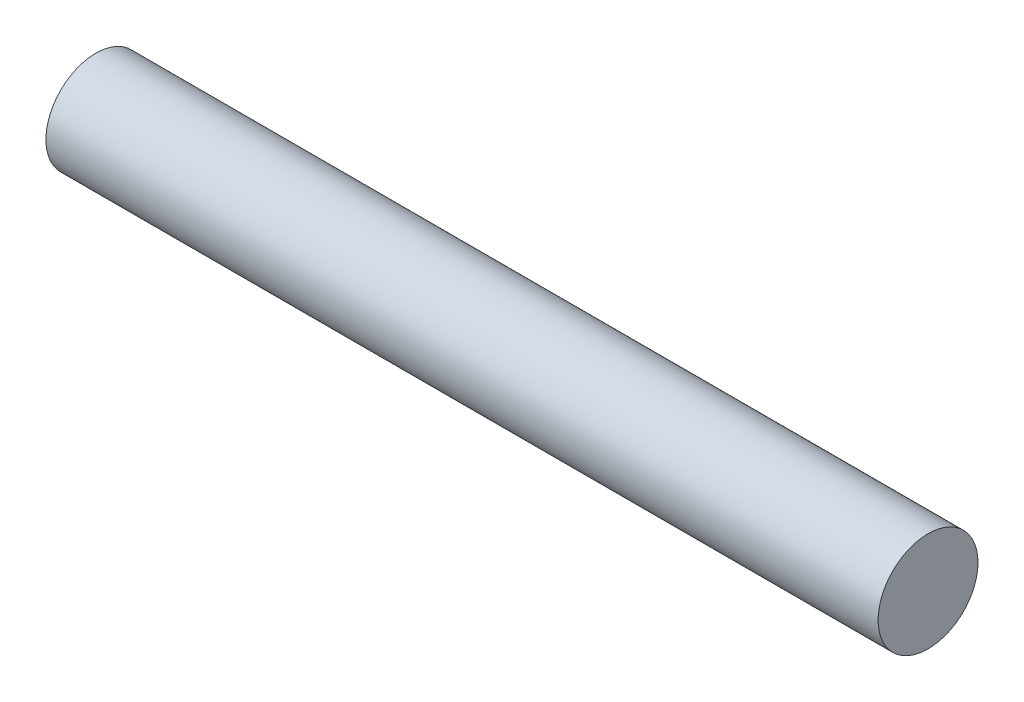
ISO-10303-21;
HEADER;
FILE_DESCRIPTION(('STEP AP214'),'2;1');
FILE_NAME('part.step','',(''),(''),'','','');
FILE_SCHEMA(('AUTOMOTIVE_DESIGN { 1 0 10303 214 1 1 1 1 }'));
ENDSEC;
DATA;
#1=APPLICATION_CONTEXT('core data for automotive mechanical design processes');
#2=APPLICATION_PROTOCOL_DEFINITION('international standard','automotive_design',2000,#1);
#3=PRODUCT_CONTEXT('',#1,'mechanical');
#4=PRODUCT('Part','Part','',(#3));
#5=PRODUCT_RELATED_PRODUCT_CATEGORY('part','',(#4));
#6=PRODUCT_DEFINITION_FORMATION('','',#4);
#7=PRODUCT_DEFINITION_CONTEXT('part definition',#1,'design');
#8=PRODUCT_DEFINITION('design','',#6,#7);
#9=PRODUCT_DEFINITION_SHAPE('','',#8);
#10=(LENGTH_UNIT() NAMED_UNIT(*) SI_UNIT(.MILLI.,.METRE.));
#11=(NAMED_UNIT(*) PLANE_ANGLE_UNIT() SI_UNIT($,.RADIAN.));
#12=(NAMED_UNIT(*) SI_UNIT($,.STERADIAN.) SOLID_ANGLE_UNIT());
#13=UNCERTAINTY_MEASURE_WITH_UNIT(LENGTH_MEASURE(1.E-05),#10,'distance_accuracy_value','');
#14=(GEOMETRIC_REPRESENTATION_CONTEXT(3) GLOBAL_UNCERTAINTY_ASSIGNED_CONTEXT((#13)) GLOBAL_UNIT_ASSIGNED_CONTEXT((#10,
#11,#12)) REPRESENTATION_CONTEXT('',''));
#15=CARTESIAN_POINT('',(0.,0.,0.));
#16=DIRECTION('',(0.,0.,1.));
#17=DIRECTION('',(1.,0.,0.));
#18=AXIS2_PLACEMENT_3D('',#15,#16,#17);
#19=CARTESIAN_POINT('',(50.,0.,0.));
#20=DIRECTION('',(-1.,0.,0.));
#21=DIRECTION('',(0.,0.,1.));
#22=AXIS2_PLACEMENT_3D('',#19,#20,#21);
#23=CYLINDRICAL_SURFACE('',#22,3.);
#24=CARTESIAN_POINT('',(50.,0.,0.));
#25=DIRECTION('',(1.,0.,0.));
#26=DIRECTION('',(0.,0.,-1.));
#27=AXIS2_PLACEMENT_3D('',#24,#25,#26);
#28=CIRCLE('',#27,3.);
#29=CARTESIAN_POINT('',(50.,0.,-3.));
#30=VERTEX_POINT('',#29);
#31=EDGE_CURVE('E10',#30,#30,#28,.T.);
#32=ORIENTED_EDGE('',*,*,#31,.F.);
#33=EDGE_LOOP('',(#32));
#34=FACE_BOUND('',#33,.T.);
#35=CARTESIAN_POINT('',(0.,0.,0.));
#36=DIRECTION('',(1.,0.,0.));
#37=DIRECTION('',(0.,0.,-1.));
#38=AXIS2_PLACEMENT_3D('',#35,#36,#37);
#39=CIRCLE('',#38,3.);
#40=CARTESIAN_POINT('',(0.,0.,-3.));
#41=VERTEX_POINT('',#40);
#42=EDGE_CURVE('E38',#41,#41,#39,.T.);
#43=ORIENTED_EDGE('',*,*,#42,.T.);
#44=EDGE_LOOP('',(#43));
#45=FACE_BOUND('',#44,.T.);
#46=ADVANCED_FACE('F35',(#34,#45),#23,.T.);
#47=CARTESIAN_POINT('',(50.,0.,0.));
#48=DIRECTION('',(1.,0.,0.));
#49=DIRECTION('',(0.,0.,-1.));
#50=AXIS2_PLACEMENT_3D('',#47,#48,#49);
#51=PLANE('',#50);
#52=ORIENTED_EDGE('',*,*,#31,.T.);
#53=EDGE_LOOP('',(#52));
#54=FACE_BOUND('',#53,.T.);
#55=ADVANCED_FACE('F50',(#54),#51,.T.);
#56=CARTESIAN_POINT('',(0.,0.,0.));
#57=DIRECTION('',(1.,0.,0.));
#58=DIRECTION('',(0.,0.,-1.));
#59=AXIS2_PLACEMENT_3D('',#56,#57,#58);
#60=PLANE('',#59);
#61=ORIENTED_EDGE('',*,*,#42,.F.);
#62=EDGE_LOOP('',(#61));
#63=FACE_BOUND('',#62,.T.);
#64=ADVANCED_FACE('F48',(#63),#60,.F.);
#65=CLOSED_SHELL('',(#46,#55,#64));
#66=MANIFOLD_SOLID_BREP('B2',#65);
#67=ADVANCED_BREP_SHAPE_REPRESENTATION('',(#18,#66),#14);
#68=SHAPE_DEFINITION_REPRESENTATION(#9,#67);
ENDSEC;
END-ISO-10303-21;
